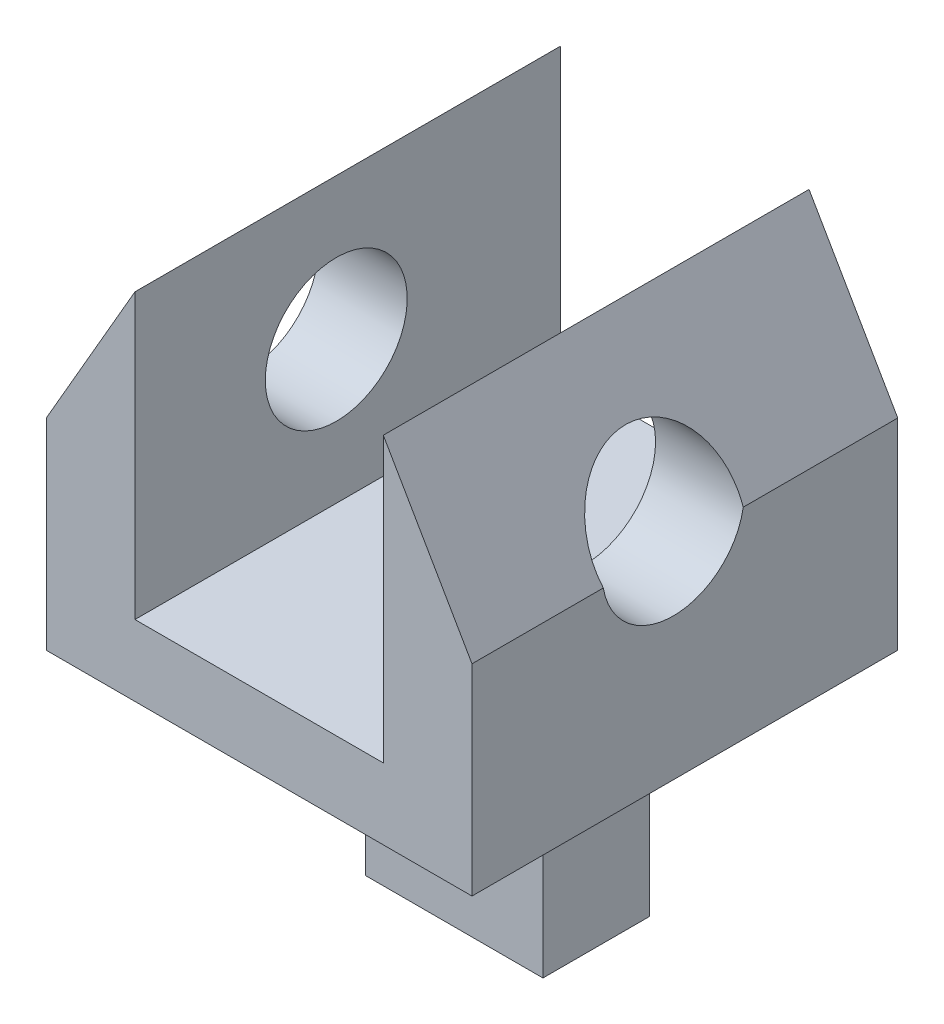
ISO-10303-21;
HEADER;
FILE_DESCRIPTION(('STEP AP214'),'2;1');
FILE_NAME('part.step','',(''),(''),'','','');
FILE_SCHEMA(('AUTOMOTIVE_DESIGN { 1 0 10303 214 1 1 1 1 }'));
ENDSEC;
DATA;
#1=APPLICATION_CONTEXT('core data for automotive mechanical design processes');
#2=APPLICATION_PROTOCOL_DEFINITION('international standard','automotive_design',2000,#1);
#3=PRODUCT_CONTEXT('',#1,'mechanical');
#4=PRODUCT('Part','Part','',(#3));
#5=PRODUCT_RELATED_PRODUCT_CATEGORY('part','',(#4));
#6=PRODUCT_DEFINITION_FORMATION('','',#4);
#7=PRODUCT_DEFINITION_CONTEXT('part definition',#1,'design');
#8=PRODUCT_DEFINITION('design','',#6,#7);
#9=PRODUCT_DEFINITION_SHAPE('','',#8);
#10=(LENGTH_UNIT() NAMED_UNIT(*) SI_UNIT(.MILLI.,.METRE.));
#11=(NAMED_UNIT(*) PLANE_ANGLE_UNIT() SI_UNIT($,.RADIAN.));
#12=(NAMED_UNIT(*) SI_UNIT($,.STERADIAN.) SOLID_ANGLE_UNIT());
#13=UNCERTAINTY_MEASURE_WITH_UNIT(LENGTH_MEASURE(1.E-05),#10,'distance_accuracy_value','');
#14=(GEOMETRIC_REPRESENTATION_CONTEXT(3) GLOBAL_UNCERTAINTY_ASSIGNED_CONTEXT((#13)) GLOBAL_UNIT_ASSIGNED_CONTEXT((#10,
#11,#12)) REPRESENTATION_CONTEXT('',''));
#15=CARTESIAN_POINT('',(0.,0.,0.));
#16=DIRECTION('',(0.,0.,1.));
#17=DIRECTION('',(1.,0.,0.));
#18=AXIS2_PLACEMENT_3D('',#15,#16,#17);
#19=CARTESIAN_POINT('',(-6.,2.,6.));
#20=DIRECTION('',(1.,0.,0.));
#21=DIRECTION('',(0.,0.,-1.));
#22=AXIS2_PLACEMENT_3D('',#19,#20,#21);
#23=PLANE('',#22);
#24=CARTESIAN_POINT('',(-6.,6.,0.326138493477825));
#25=DIRECTION('',(-1.,0.,0.));
#26=DIRECTION('',(0.,0.,1.));
#27=AXIS2_PLACEMENT_3D('',#24,#25,#26);
#28=CIRCLE('',#27,2.);
#29=CARTESIAN_POINT('',(-6.,5.66987298107782,-1.64642738663304));
#30=VERTEX_POINT('',#29);
#31=CARTESIAN_POINT('',(-6.,5.66987298107782,2.29870437358869));
#32=VERTEX_POINT('',#31);
#33=EDGE_CURVE('E192',#30,#32,#28,.T.);
#34=ORIENTED_EDGE('',*,*,#33,.F.);
#35=DIRECTION('',(0.,0.,1.));
#36=VECTOR('',#35,1.);
#37=CARTESIAN_POINT('',(-6.,5.66987298107782,-6.));
#38=LINE('',#37,#36);
#39=CARTESIAN_POINT('',(-6.,5.66987298107782,-6.));
#40=VERTEX_POINT('',#39);
#41=EDGE_CURVE('E149',#40,#30,#38,.T.);
#42=ORIENTED_EDGE('',*,*,#41,.F.);
#43=DIRECTION('',(0.,-1.,0.));
#44=VECTOR('',#43,1.);
#45=CARTESIAN_POINT('',(-6.,2.,-6.));
#46=LINE('',#45,#44);
#47=CARTESIAN_POINT('',(-6.,-10.,-6.));
#48=VERTEX_POINT('',#47);
#49=EDGE_CURVE('E142',#40,#48,#46,.T.);
#50=ORIENTED_EDGE('',*,*,#49,.T.);
#51=DIRECTION('',(0.,0.,-1.));
#52=VECTOR('',#51,1.);
#53=CARTESIAN_POINT('',(-6.,-10.,-6.));
#54=LINE('',#53,#52);
#55=CARTESIAN_POINT('',(-6.,-10.,-3.));
#56=VERTEX_POINT('',#55);
#57=EDGE_CURVE('E150',#56,#48,#54,.T.);
#58=ORIENTED_EDGE('',*,*,#57,.F.);
#59=DIRECTION('',(0.,1.,0.));
#60=VECTOR('',#59,1.);
#61=CARTESIAN_POINT('',(-6.,-10.,-3.));
#62=LINE('',#61,#60);
#63=CARTESIAN_POINT('',(-6.,0.,-3.));
#64=VERTEX_POINT('',#63);
#65=EDGE_CURVE('E185',#56,#64,#62,.T.);
#66=ORIENTED_EDGE('',*,*,#65,.T.);
#67=DIRECTION('',(0.,0.,1.));
#68=VECTOR('',#67,1.);
#69=CARTESIAN_POINT('',(-6.,0.,6.));
#70=LINE('',#69,#68);
#71=CARTESIAN_POINT('',(-6.,0.,6.));
#72=VERTEX_POINT('',#71);
#73=EDGE_CURVE('E70',#64,#72,#70,.T.);
#74=ORIENTED_EDGE('',*,*,#73,.T.);
#75=DIRECTION('',(0.,-1.,0.));
#76=VECTOR('',#75,1.);
#77=CARTESIAN_POINT('',(-6.,2.,6.));
#78=LINE('',#77,#76);
#79=CARTESIAN_POINT('',(-6.,5.66987298107781,6.));
#80=VERTEX_POINT('',#79);
#81=EDGE_CURVE('E153',#80,#72,#78,.T.);
#82=ORIENTED_EDGE('',*,*,#81,.F.);
#83=EDGE_CURVE('E216',#32,#80,#38,.T.);
#84=ORIENTED_EDGE('',*,*,#83,.F.);
#85=EDGE_LOOP('',(#34,#42,#50,#58,#66,#74,#82,#84));
#86=FACE_BOUND('',#85,.T.);
#87=ADVANCED_FACE('F44',(#86),#23,.F.);
#88=CARTESIAN_POINT('',(-6.,2.,6.));
#89=DIRECTION('',(0.,0.,-1.));
#90=DIRECTION('',(-1.,0.,0.));
#91=AXIS2_PLACEMENT_3D('',#88,#89,#90);
#92=PLANE('',#91);
#93=DIRECTION('',(0.500000000000001,0.866025403784438,0.));
#94=VECTOR('',#93,1.);
#95=CARTESIAN_POINT('',(-3.5,10.,6.));
#96=LINE('',#95,#94);
#97=CARTESIAN_POINT('',(-3.5,10.,6.));
#98=VERTEX_POINT('',#97);
#99=EDGE_CURVE('E220',#80,#98,#96,.T.);
#100=ORIENTED_EDGE('',*,*,#99,.F.);
#101=ORIENTED_EDGE('',*,*,#81,.T.);
#102=DIRECTION('',(1.,0.,0.));
#103=VECTOR('',#102,1.);
#104=CARTESIAN_POINT('',(-6.,0.,6.));
#105=LINE('',#104,#103);
#106=CARTESIAN_POINT('',(6.,0.,6.));
#107=VERTEX_POINT('',#106);
#108=EDGE_CURVE('E267',#72,#107,#105,.T.);
#109=ORIENTED_EDGE('',*,*,#108,.T.);
#110=DIRECTION('',(0.,-1.,0.));
#111=VECTOR('',#110,1.);
#112=CARTESIAN_POINT('',(6.,2.,6.));
#113=LINE('',#112,#111);
#114=CARTESIAN_POINT('',(6.,5.66987298107782,6.));
#115=VERTEX_POINT('',#114);
#116=EDGE_CURVE('E275',#115,#107,#113,.T.);
#117=ORIENTED_EDGE('',*,*,#116,.F.);
#118=DIRECTION('',(0.500000000000001,-0.866025403784438,0.));
#119=VECTOR('',#118,1.);
#120=CARTESIAN_POINT('',(3.5,10.,6.));
#121=LINE('',#120,#119);
#122=CARTESIAN_POINT('',(3.5,10.,6.));
#123=VERTEX_POINT('',#122);
#124=EDGE_CURVE('E219',#123,#115,#121,.T.);
#125=ORIENTED_EDGE('',*,*,#124,.F.);
#126=DIRECTION('',(0.,-1.,0.));
#127=VECTOR('',#126,1.);
#128=CARTESIAN_POINT('',(3.5,10.,6.));
#129=LINE('',#128,#127);
#130=CARTESIAN_POINT('',(3.5,2.,6.));
#131=VERTEX_POINT('',#130);
#132=EDGE_CURVE('E254',#123,#131,#129,.T.);
#133=ORIENTED_EDGE('',*,*,#132,.T.);
#134=DIRECTION('',(1.,0.,0.));
#135=VECTOR('',#134,1.);
#136=CARTESIAN_POINT('',(-6.,2.,6.));
#137=LINE('',#136,#135);
#138=CARTESIAN_POINT('',(-3.5,2.,6.));
#139=VERTEX_POINT('',#138);
#140=EDGE_CURVE('E268',#139,#131,#137,.T.);
#141=ORIENTED_EDGE('',*,*,#140,.F.);
#142=DIRECTION('',(0.,-1.,0.));
#143=VECTOR('',#142,1.);
#144=CARTESIAN_POINT('',(-3.5,10.,6.));
#145=LINE('',#144,#143);
#146=EDGE_CURVE('E250',#98,#139,#145,.T.);
#147=ORIENTED_EDGE('',*,*,#146,.F.);
#148=EDGE_LOOP('',(#100,#101,#109,#117,#125,#133,#141,#147));
#149=FACE_BOUND('',#148,.T.);
#150=ADVANCED_FACE('F298',(#149),#92,.F.);
#151=CARTESIAN_POINT('',(0.,2.,0.));
#152=DIRECTION('',(0.,-1.,0.));
#153=DIRECTION('',(0.,0.,-1.));
#154=AXIS2_PLACEMENT_3D('',#151,#152,#153);
#155=PLANE('',#154);
#156=DIRECTION('',(0.,0.,-1.));
#157=VECTOR('',#156,1.);
#158=CARTESIAN_POINT('',(-3.5,2.,-6.));
#159=LINE('',#158,#157);
#160=CARTESIAN_POINT('',(-3.5,2.,-6.));
#161=VERTEX_POINT('',#160);
#162=EDGE_CURVE('E239',#139,#161,#159,.T.);
#163=ORIENTED_EDGE('',*,*,#162,.F.);
#164=ORIENTED_EDGE('',*,*,#140,.T.);
#165=DIRECTION('',(0.,0.,1.));
#166=VECTOR('',#165,1.);
#167=CARTESIAN_POINT('',(3.5,2.,6.));
#168=LINE('',#167,#166);
#169=CARTESIAN_POINT('',(3.5,2.,-6.));
#170=VERTEX_POINT('',#169);
#171=EDGE_CURVE('E245',#170,#131,#168,.T.);
#172=ORIENTED_EDGE('',*,*,#171,.F.);
#173=DIRECTION('',(-1.,0.,0.));
#174=VECTOR('',#173,1.);
#175=CARTESIAN_POINT('',(-6.,2.,-6.));
#176=LINE('',#175,#174);
#177=EDGE_CURVE('E264',#170,#161,#176,.T.);
#178=ORIENTED_EDGE('',*,*,#177,.T.);
#179=EDGE_LOOP('',(#163,#164,#172,#178));
#180=FACE_BOUND('',#179,.T.);
#181=ADVANCED_FACE('F330',(#180),#155,.F.);
#182=CARTESIAN_POINT('',(6.,2.,6.));
#183=DIRECTION('',(-1.,0.,0.));
#184=DIRECTION('',(0.,0.,1.));
#185=AXIS2_PLACEMENT_3D('',#182,#183,#184);
#186=PLANE('',#185);
#187=DIRECTION('',(0.,0.,1.));
#188=VECTOR('',#187,1.);
#189=CARTESIAN_POINT('',(6.,5.66987298107782,-6.));
#190=LINE('',#189,#188);
#191=CARTESIAN_POINT('',(6.,5.66987298107782,-6.));
#192=VERTEX_POINT('',#191);
#193=CARTESIAN_POINT('',(6.,5.66987298107782,-1.64642738663304));
#194=VERTEX_POINT('',#193);
#195=EDGE_CURVE('E221',#192,#194,#190,.T.);
#196=ORIENTED_EDGE('',*,*,#195,.T.);
#197=CARTESIAN_POINT('',(6.,6.,0.326138493477825));
#198=DIRECTION('',(-1.,0.,0.));
#199=DIRECTION('',(0.,0.,1.));
#200=AXIS2_PLACEMENT_3D('',#197,#198,#199);
#201=CIRCLE('',#200,2.);
#202=CARTESIAN_POINT('',(6.,5.66987298107782,2.29870437358869));
#203=VERTEX_POINT('',#202);
#204=EDGE_CURVE('E198',#194,#203,#201,.T.);
#205=ORIENTED_EDGE('',*,*,#204,.T.);
#206=EDGE_CURVE('E215',#203,#115,#190,.T.);
#207=ORIENTED_EDGE('',*,*,#206,.T.);
#208=ORIENTED_EDGE('',*,*,#116,.T.);
#209=DIRECTION('',(0.,0.,-1.));
#210=VECTOR('',#209,1.);
#211=CARTESIAN_POINT('',(6.,0.,6.));
#212=LINE('',#211,#210);
#213=CARTESIAN_POINT('',(6.,0.,-6.));
#214=VERTEX_POINT('',#213);
#215=EDGE_CURVE('E253',#107,#214,#212,.T.);
#216=ORIENTED_EDGE('',*,*,#215,.T.);
#217=DIRECTION('',(0.,-1.,0.));
#218=VECTOR('',#217,1.);
#219=CARTESIAN_POINT('',(6.,2.,-6.));
#220=LINE('',#219,#218);
#221=EDGE_CURVE('E53',#192,#214,#220,.T.);
#222=ORIENTED_EDGE('',*,*,#221,.F.);
#223=EDGE_LOOP('',(#196,#205,#207,#208,#216,#222));
#224=FACE_BOUND('',#223,.T.);
#225=ADVANCED_FACE('F50',(#224),#186,.F.);
#226=CARTESIAN_POINT('',(-6.,2.,-6.));
#227=DIRECTION('',(0.,0.,1.));
#228=DIRECTION('',(1.,0.,0.));
#229=AXIS2_PLACEMENT_3D('',#226,#227,#228);
#230=PLANE('',#229);
#231=CARTESIAN_POINT('',(-3.5,-5.,-6.));
#232=DIRECTION('',(0.,0.,1.));
#233=DIRECTION('',(1.,0.,0.));
#234=AXIS2_PLACEMENT_3D('',#231,#232,#233);
#235=CIRCLE('',#234,1.49999999999999);
#236=CARTESIAN_POINT('',(-2.00000000000001,-5.,-6.));
#237=VERTEX_POINT('',#236);
#238=EDGE_CURVE('E172',#237,#237,#235,.T.);
#239=ORIENTED_EDGE('',*,*,#238,.T.);
#240=EDGE_LOOP('',(#239));
#241=FACE_BOUND('',#240,.T.);
#242=ORIENTED_EDGE('',*,*,#49,.F.);
#243=DIRECTION('',(0.500000000000001,0.866025403784438,0.));
#244=VECTOR('',#243,1.);
#245=CARTESIAN_POINT('',(-3.5,10.,-6.));
#246=LINE('',#245,#244);
#247=CARTESIAN_POINT('',(-3.5,10.,-6.));
#248=VERTEX_POINT('',#247);
#249=EDGE_CURVE('E213',#40,#248,#246,.T.);
#250=ORIENTED_EDGE('',*,*,#249,.T.);
#251=DIRECTION('',(0.,-1.,0.));
#252=VECTOR('',#251,1.);
#253=CARTESIAN_POINT('',(-3.5,10.,-6.));
#254=LINE('',#253,#252);
#255=EDGE_CURVE('E236',#248,#161,#254,.T.);
#256=ORIENTED_EDGE('',*,*,#255,.T.);
#257=ORIENTED_EDGE('',*,*,#177,.F.);
#258=DIRECTION('',(0.,-1.,0.));
#259=VECTOR('',#258,1.);
#260=CARTESIAN_POINT('',(3.5,10.,-6.));
#261=LINE('',#260,#259);
#262=CARTESIAN_POINT('',(3.5,10.,-6.));
#263=VERTEX_POINT('',#262);
#264=EDGE_CURVE('E224',#263,#170,#261,.T.);
#265=ORIENTED_EDGE('',*,*,#264,.F.);
#266=DIRECTION('',(0.500000000000001,-0.866025403784438,0.));
#267=VECTOR('',#266,1.);
#268=CARTESIAN_POINT('',(3.5,10.,-6.));
#269=LINE('',#268,#267);
#270=EDGE_CURVE('E230',#263,#192,#269,.T.);
#271=ORIENTED_EDGE('',*,*,#270,.T.);
#272=ORIENTED_EDGE('',*,*,#221,.T.);
#273=DIRECTION('',(-1.,0.,0.));
#274=VECTOR('',#273,1.);
#275=CARTESIAN_POINT('',(-6.,0.,-6.));
#276=LINE('',#275,#274);
#277=CARTESIAN_POINT('',(-1.,0.,-6.));
#278=VERTEX_POINT('',#277);
#279=EDGE_CURVE('E277',#214,#278,#276,.T.);
#280=ORIENTED_EDGE('',*,*,#279,.T.);
#281=DIRECTION('',(0.,1.,0.));
#282=VECTOR('',#281,1.);
#283=CARTESIAN_POINT('',(-1.,-10.,-6.));
#284=LINE('',#283,#282);
#285=CARTESIAN_POINT('',(-1.,-10.,-6.));
#286=VERTEX_POINT('',#285);
#287=EDGE_CURVE('E157',#286,#278,#284,.T.);
#288=ORIENTED_EDGE('',*,*,#287,.F.);
#289=DIRECTION('',(1.,0.,0.));
#290=VECTOR('',#289,1.);
#291=CARTESIAN_POINT('',(-6.,-10.,-6.));
#292=LINE('',#291,#290);
#293=EDGE_CURVE('E156',#48,#286,#292,.T.);
#294=ORIENTED_EDGE('',*,*,#293,.F.);
#295=EDGE_LOOP('',(#242,#250,#256,#257,#265,#271,#272,#280,#288,#294));
#296=FACE_BOUND('',#295,.T.);
#297=ADVANCED_FACE('F160',(#241,#296),#230,.F.);
#298=CARTESIAN_POINT('',(0.,0.,0.));
#299=DIRECTION('',(0.,-1.,0.));
#300=DIRECTION('',(0.,0.,-1.));
#301=AXIS2_PLACEMENT_3D('',#298,#299,#300);
#302=PLANE('',#301);
#303=DIRECTION('',(-1.,0.,0.));
#304=VECTOR('',#303,1.);
#305=CARTESIAN_POINT('',(-6.,0.,-3.));
#306=LINE('',#305,#304);
#307=CARTESIAN_POINT('',(-1.,0.,-3.));
#308=VERTEX_POINT('',#307);
#309=EDGE_CURVE('E168',#308,#64,#306,.T.);
#310=ORIENTED_EDGE('',*,*,#309,.F.);
#311=DIRECTION('',(0.,0.,1.));
#312=VECTOR('',#311,1.);
#313=CARTESIAN_POINT('',(-1.,0.,-6.));
#314=LINE('',#313,#312);
#315=EDGE_CURVE('E64',#278,#308,#314,.T.);
#316=ORIENTED_EDGE('',*,*,#315,.F.);
#317=ORIENTED_EDGE('',*,*,#279,.F.);
#318=ORIENTED_EDGE('',*,*,#215,.F.);
#319=ORIENTED_EDGE('',*,*,#108,.F.);
#320=ORIENTED_EDGE('',*,*,#73,.F.);
#321=EDGE_LOOP('',(#310,#316,#317,#318,#319,#320));
#322=FACE_BOUND('',#321,.T.);
#323=ADVANCED_FACE('F291',(#322),#302,.T.);
#324=CARTESIAN_POINT('',(3.5,10.,6.));
#325=DIRECTION('',(1.,0.,0.));
#326=DIRECTION('',(0.,0.,-1.));
#327=AXIS2_PLACEMENT_3D('',#324,#325,#326);
#328=PLANE('',#327);
#329=CARTESIAN_POINT('',(3.5,6.,0.326138493477825));
#330=DIRECTION('',(1.,0.,0.));
#331=DIRECTION('',(0.,0.,-1.));
#332=AXIS2_PLACEMENT_3D('',#329,#330,#331);
#333=CIRCLE('',#332,2.);
#334=CARTESIAN_POINT('',(3.5,6.,-1.67386150652218));
#335=VERTEX_POINT('',#334);
#336=EDGE_CURVE('E208',#335,#335,#333,.T.);
#337=ORIENTED_EDGE('',*,*,#336,.T.);
#338=EDGE_LOOP('',(#337));
#339=FACE_BOUND('',#338,.T.);
#340=ORIENTED_EDGE('',*,*,#171,.T.);
#341=ORIENTED_EDGE('',*,*,#132,.F.);
#342=DIRECTION('',(0.,0.,1.));
#343=VECTOR('',#342,1.);
#344=CARTESIAN_POINT('',(3.5,10.,6.));
#345=LINE('',#344,#343);
#346=EDGE_CURVE('E259',#263,#123,#345,.T.);
#347=ORIENTED_EDGE('',*,*,#346,.F.);
#348=ORIENTED_EDGE('',*,*,#264,.T.);
#349=EDGE_LOOP('',(#340,#341,#347,#348));
#350=FACE_BOUND('',#349,.T.);
#351=ADVANCED_FACE('F331',(#339,#350),#328,.F.);
#352=CARTESIAN_POINT('',(-3.5,10.,-6.));
#353=DIRECTION('',(-1.,0.,0.));
#354=DIRECTION('',(0.,0.,1.));
#355=AXIS2_PLACEMENT_3D('',#352,#353,#354);
#356=PLANE('',#355);
#357=CARTESIAN_POINT('',(-3.5,6.,0.326138493477825));
#358=DIRECTION('',(-1.,0.,0.));
#359=DIRECTION('',(0.,0.,1.));
#360=AXIS2_PLACEMENT_3D('',#357,#358,#359);
#361=CIRCLE('',#360,2.);
#362=CARTESIAN_POINT('',(-3.5,6.,2.32613849347783));
#363=VERTEX_POINT('',#362);
#364=EDGE_CURVE('E204',#363,#363,#361,.T.);
#365=ORIENTED_EDGE('',*,*,#364,.T.);
#366=EDGE_LOOP('',(#365));
#367=FACE_BOUND('',#366,.T.);
#368=ORIENTED_EDGE('',*,*,#162,.T.);
#369=ORIENTED_EDGE('',*,*,#255,.F.);
#370=DIRECTION('',(0.,0.,-1.));
#371=VECTOR('',#370,1.);
#372=CARTESIAN_POINT('',(-3.5,10.,-6.));
#373=LINE('',#372,#371);
#374=EDGE_CURVE('E234',#98,#248,#373,.T.);
#375=ORIENTED_EDGE('',*,*,#374,.F.);
#376=ORIENTED_EDGE('',*,*,#146,.T.);
#377=EDGE_LOOP('',(#368,#369,#375,#376));
#378=FACE_BOUND('',#377,.T.);
#379=ADVANCED_FACE('F412',(#367,#378),#356,.F.);
#380=CARTESIAN_POINT('',(3.5,10.,-6.));
#381=DIRECTION('',(-0.866025403784438,-0.500000000000001,0.));
#382=DIRECTION('',(0.500000000000001,-0.866025403784438,0.));
#383=AXIS2_PLACEMENT_3D('',#380,#381,#382);
#384=PLANE('',#383);
#385=ORIENTED_EDGE('',*,*,#206,.F.);
#386=CARTESIAN_POINT('',(5.80940107675851,6.,0.326138493477825));
#387=DIRECTION('',(-0.866025403784438,-0.500000000000001,0.));
#388=DIRECTION('',(-0.500000000000001,0.866025403784438,0.));
#389=AXIS2_PLACEMENT_3D('',#386,#387,#388);
#390=ELLIPSE('',#389,2.30940107675851,2.);
#391=EDGE_CURVE('E199',#203,#194,#390,.T.);
#392=ORIENTED_EDGE('',*,*,#391,.T.);
#393=ORIENTED_EDGE('',*,*,#195,.F.);
#394=ORIENTED_EDGE('',*,*,#270,.F.);
#395=ORIENTED_EDGE('',*,*,#346,.T.);
#396=ORIENTED_EDGE('',*,*,#124,.T.);
#397=EDGE_LOOP('',(#385,#392,#393,#394,#395,#396));
#398=FACE_BOUND('',#397,.T.);
#399=ADVANCED_FACE('F404',(#398),#384,.F.);
#400=CARTESIAN_POINT('',(-3.5,10.,-6.));
#401=DIRECTION('',(0.866025403784438,-0.500000000000001,0.));
#402=DIRECTION('',(0.500000000000001,0.866025403784438,0.));
#403=AXIS2_PLACEMENT_3D('',#400,#401,#402);
#404=PLANE('',#403);
#405=ORIENTED_EDGE('',*,*,#41,.T.);
#406=CARTESIAN_POINT('',(-5.80940107675851,6.,0.326138493477825));
#407=DIRECTION('',(0.866025403784438,-0.500000000000001,0.));
#408=DIRECTION('',(-0.500000000000001,-0.866025403784438,0.));
#409=AXIS2_PLACEMENT_3D('',#406,#407,#408);
#410=ELLIPSE('',#409,2.30940107675851,2.);
#411=EDGE_CURVE('E11',#30,#32,#410,.T.);
#412=ORIENTED_EDGE('',*,*,#411,.T.);
#413=ORIENTED_EDGE('',*,*,#83,.T.);
#414=ORIENTED_EDGE('',*,*,#99,.T.);
#415=ORIENTED_EDGE('',*,*,#374,.T.);
#416=ORIENTED_EDGE('',*,*,#249,.F.);
#417=EDGE_LOOP('',(#405,#412,#413,#414,#415,#416));
#418=FACE_BOUND('',#417,.T.);
#419=ADVANCED_FACE('F392',(#418),#404,.F.);
#420=CARTESIAN_POINT('',(6.,6.,0.326138493477825));
#421=DIRECTION('',(-1.,0.,0.));
#422=DIRECTION('',(0.,0.,1.));
#423=AXIS2_PLACEMENT_3D('',#420,#421,#422);
#424=CYLINDRICAL_SURFACE('',#423,2.);
#425=ORIENTED_EDGE('',*,*,#33,.T.);
#426=ORIENTED_EDGE('',*,*,#411,.F.);
#427=EDGE_LOOP('',(#425,#426));
#428=FACE_BOUND('',#427,.T.);
#429=ORIENTED_EDGE('',*,*,#364,.F.);
#430=EDGE_LOOP('',(#429));
#431=FACE_BOUND('',#430,.T.);
#432=ADVANCED_FACE('F317',(#428,#431),#424,.F.);
#433=ORIENTED_EDGE('',*,*,#204,.F.);
#434=ORIENTED_EDGE('',*,*,#391,.F.);
#435=EDGE_LOOP('',(#433,#434));
#436=FACE_BOUND('',#435,.T.);
#437=ORIENTED_EDGE('',*,*,#336,.F.);
#438=EDGE_LOOP('',(#437));
#439=FACE_BOUND('',#438,.T.);
#440=ADVANCED_FACE('F310',(#436,#439),#424,.F.);
#441=CARTESIAN_POINT('',(-1.,-10.,-6.));
#442=DIRECTION('',(-1.,0.,0.));
#443=DIRECTION('',(0.,0.,1.));
#444=AXIS2_PLACEMENT_3D('',#441,#442,#443);
#445=PLANE('',#444);
#446=ORIENTED_EDGE('',*,*,#315,.T.);
#447=DIRECTION('',(0.,1.,0.));
#448=VECTOR('',#447,1.);
#449=CARTESIAN_POINT('',(-1.,-10.,-3.));
#450=LINE('',#449,#448);
#451=CARTESIAN_POINT('',(-1.,-10.,-3.));
#452=VERTEX_POINT('',#451);
#453=EDGE_CURVE('E186',#452,#308,#450,.T.);
#454=ORIENTED_EDGE('',*,*,#453,.F.);
#455=DIRECTION('',(0.,0.,1.));
#456=VECTOR('',#455,1.);
#457=CARTESIAN_POINT('',(-1.,-10.,-6.));
#458=LINE('',#457,#456);
#459=EDGE_CURVE('E162',#286,#452,#458,.T.);
#460=ORIENTED_EDGE('',*,*,#459,.F.);
#461=ORIENTED_EDGE('',*,*,#287,.T.);
#462=EDGE_LOOP('',(#446,#454,#460,#461));
#463=FACE_BOUND('',#462,.T.);
#464=ADVANCED_FACE('F307',(#463),#445,.F.);
#465=CARTESIAN_POINT('',(-6.,-10.,-3.));
#466=DIRECTION('',(0.,0.,-1.));
#467=DIRECTION('',(-1.,0.,0.));
#468=AXIS2_PLACEMENT_3D('',#465,#466,#467);
#469=PLANE('',#468);
#470=CARTESIAN_POINT('',(-3.5,-5.,-3.));
#471=DIRECTION('',(0.,0.,1.));
#472=DIRECTION('',(1.,0.,0.));
#473=AXIS2_PLACEMENT_3D('',#470,#471,#472);
#474=CIRCLE('',#473,1.49999999999999);
#475=CARTESIAN_POINT('',(-2.00000000000001,-5.,-3.));
#476=VERTEX_POINT('',#475);
#477=EDGE_CURVE('E337',#476,#476,#474,.T.);
#478=ORIENTED_EDGE('',*,*,#477,.F.);
#479=EDGE_LOOP('',(#478));
#480=FACE_BOUND('',#479,.T.);
#481=ORIENTED_EDGE('',*,*,#309,.T.);
#482=ORIENTED_EDGE('',*,*,#65,.F.);
#483=DIRECTION('',(-1.,0.,0.));
#484=VECTOR('',#483,1.);
#485=CARTESIAN_POINT('',(-6.,-10.,-3.));
#486=LINE('',#485,#484);
#487=EDGE_CURVE('E170',#452,#56,#486,.T.);
#488=ORIENTED_EDGE('',*,*,#487,.F.);
#489=ORIENTED_EDGE('',*,*,#453,.T.);
#490=EDGE_LOOP('',(#481,#482,#488,#489));
#491=FACE_BOUND('',#490,.T.);
#492=ADVANCED_FACE('F303',(#480,#491),#469,.F.);
#493=CARTESIAN_POINT('',(0.,-10.,0.));
#494=DIRECTION('',(0.,1.,0.));
#495=DIRECTION('',(0.,0.,1.));
#496=AXIS2_PLACEMENT_3D('',#493,#494,#495);
#497=PLANE('',#496);
#498=ORIENTED_EDGE('',*,*,#57,.T.);
#499=ORIENTED_EDGE('',*,*,#293,.T.);
#500=ORIENTED_EDGE('',*,*,#459,.T.);
#501=ORIENTED_EDGE('',*,*,#487,.T.);
#502=EDGE_LOOP('',(#498,#499,#500,#501));
#503=FACE_BOUND('',#502,.T.);
#504=ADVANCED_FACE('F164',(#503),#497,.F.);
#505=CARTESIAN_POINT('',(-3.5,-5.,-3.));
#506=DIRECTION('',(0.,0.,1.));
#507=DIRECTION('',(1.,0.,0.));
#508=AXIS2_PLACEMENT_3D('',#505,#506,#507);
#509=CYLINDRICAL_SURFACE('',#508,1.49999999999999);
#510=ORIENTED_EDGE('',*,*,#238,.F.);
#511=EDGE_LOOP('',(#510));
#512=FACE_BOUND('',#511,.T.);
#513=ORIENTED_EDGE('',*,*,#477,.T.);
#514=EDGE_LOOP('',(#513));
#515=FACE_BOUND('',#514,.T.);
#516=ADVANCED_FACE('F344',(#512,#515),#509,.F.);
#517=CLOSED_SHELL('',(#87,#150,#181,#225,#297,#323,#351,#379,#399,#419,#432,#440,#464,#492,#504,#516));
#518=MANIFOLD_SOLID_BREP('B2',#517);
#519=ADVANCED_BREP_SHAPE_REPRESENTATION('',(#18,#518),#14);
#520=SHAPE_DEFINITION_REPRESENTATION(#9,#519);
ENDSEC;
END-ISO-10303-21;
